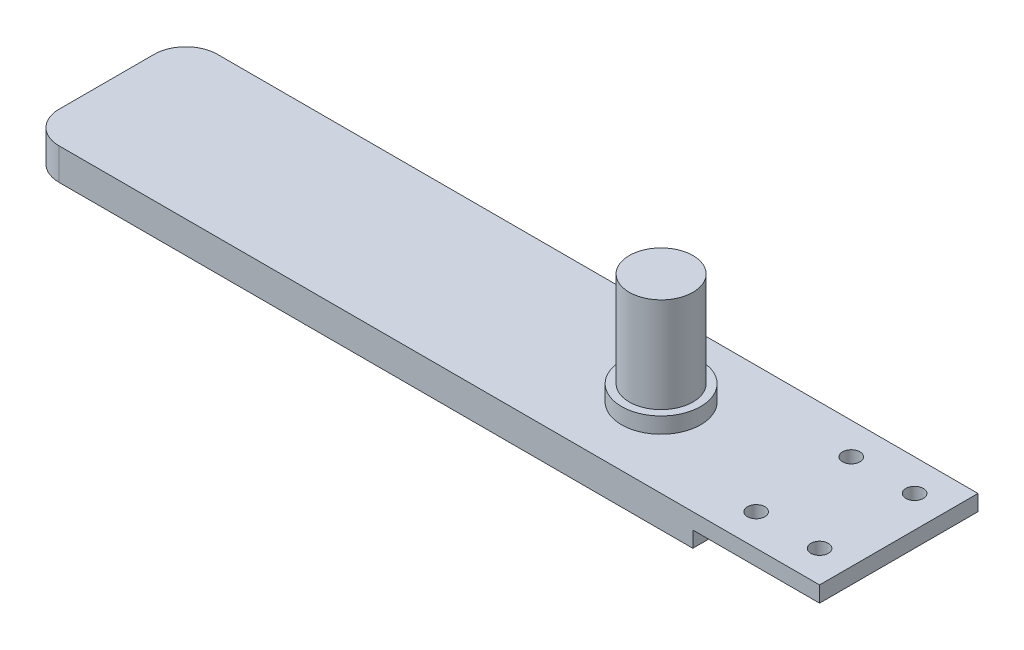
ISO-10303-21;
HEADER;
FILE_DESCRIPTION(('STEP AP214'),'2;1');
FILE_NAME('part.step','',(''),(''),'','','');
FILE_SCHEMA(('AUTOMOTIVE_DESIGN { 1 0 10303 214 1 1 1 1 }'));
ENDSEC;
DATA;
#1=APPLICATION_CONTEXT('core data for automotive mechanical design processes');
#2=APPLICATION_PROTOCOL_DEFINITION('international standard','automotive_design',2000,#1);
#3=PRODUCT_CONTEXT('',#1,'mechanical');
#4=PRODUCT('Part','Part','',(#3));
#5=PRODUCT_RELATED_PRODUCT_CATEGORY('part','',(#4));
#6=PRODUCT_DEFINITION_FORMATION('','',#4);
#7=PRODUCT_DEFINITION_CONTEXT('part definition',#1,'design');
#8=PRODUCT_DEFINITION('design','',#6,#7);
#9=PRODUCT_DEFINITION_SHAPE('','',#8);
#10=(LENGTH_UNIT() NAMED_UNIT(*) SI_UNIT(.MILLI.,.METRE.));
#11=(NAMED_UNIT(*) PLANE_ANGLE_UNIT() SI_UNIT($,.RADIAN.));
#12=(NAMED_UNIT(*) SI_UNIT($,.STERADIAN.) SOLID_ANGLE_UNIT());
#13=UNCERTAINTY_MEASURE_WITH_UNIT(LENGTH_MEASURE(1.E-05),#10,'distance_accuracy_value','');
#14=(GEOMETRIC_REPRESENTATION_CONTEXT(3) GLOBAL_UNCERTAINTY_ASSIGNED_CONTEXT((#13)) GLOBAL_UNIT_ASSIGNED_CONTEXT((#10,
#11,#12)) REPRESENTATION_CONTEXT('',''));
#15=CARTESIAN_POINT('',(0.,0.,0.));
#16=DIRECTION('',(0.,0.,1.));
#17=DIRECTION('',(1.,0.,0.));
#18=AXIS2_PLACEMENT_3D('',#15,#16,#17);
#19=CARTESIAN_POINT('',(50.,10.,-25.));
#20=DIRECTION('',(-1.,0.,0.));
#21=DIRECTION('',(0.,0.,1.));
#22=AXIS2_PLACEMENT_3D('',#19,#20,#21);
#23=PLANE('',#22);
#24=DIRECTION('',(0.,-1.,0.));
#25=VECTOR('',#24,1.);
#26=CARTESIAN_POINT('',(50.,10.,25.));
#27=LINE('',#26,#25);
#28=CARTESIAN_POINT('',(50.,10.,25.));
#29=VERTEX_POINT('',#28);
#30=CARTESIAN_POINT('',(50.,5.,25.));
#31=VERTEX_POINT('',#30);
#32=EDGE_CURVE('E122',#29,#31,#27,.T.);
#33=ORIENTED_EDGE('',*,*,#32,.T.);
#34=DIRECTION('',(0.,0.,1.));
#35=VECTOR('',#34,1.);
#36=CARTESIAN_POINT('',(50.,5.,25.));
#37=LINE('',#36,#35);
#38=CARTESIAN_POINT('',(50.,5.,-25.));
#39=VERTEX_POINT('',#38);
#40=EDGE_CURVE('E106',#39,#31,#37,.T.);
#41=ORIENTED_EDGE('',*,*,#40,.F.);
#42=DIRECTION('',(0.,-1.,0.));
#43=VECTOR('',#42,1.);
#44=CARTESIAN_POINT('',(50.,10.,-25.));
#45=LINE('',#44,#43);
#46=CARTESIAN_POINT('',(50.,10.,-25.));
#47=VERTEX_POINT('',#46);
#48=EDGE_CURVE('E130',#47,#39,#45,.T.);
#49=ORIENTED_EDGE('',*,*,#48,.F.);
#50=DIRECTION('',(0.,0.,-1.));
#51=VECTOR('',#50,1.);
#52=CARTESIAN_POINT('',(50.,10.,-25.));
#53=LINE('',#52,#51);
#54=EDGE_CURVE('E129',#29,#47,#53,.T.);
#55=ORIENTED_EDGE('',*,*,#54,.F.);
#56=EDGE_LOOP('',(#33,#41,#49,#55));
#57=FACE_BOUND('',#56,.T.);
#58=ADVANCED_FACE('F41',(#57),#23,.F.);
#59=CARTESIAN_POINT('',(-50.,10.,-25.));
#60=DIRECTION('',(0.,0.,1.));
#61=DIRECTION('',(1.,0.,0.));
#62=AXIS2_PLACEMENT_3D('',#59,#60,#61);
#63=PLANE('',#62);
#64=DIRECTION('',(-1.,0.,0.));
#65=VECTOR('',#64,1.);
#66=CARTESIAN_POINT('',(-50.,0.,-25.));
#67=LINE('',#66,#65);
#68=CARTESIAN_POINT('',(10.,0.,-25.));
#69=VERTEX_POINT('',#68);
#70=CARTESIAN_POINT('',(-190.,0.,-25.));
#71=VERTEX_POINT('',#70);
#72=EDGE_CURVE('E177',#69,#71,#67,.T.);
#73=ORIENTED_EDGE('',*,*,#72,.T.);
#74=DIRECTION('',(0.,1.,0.));
#75=VECTOR('',#74,1.);
#76=CARTESIAN_POINT('',(-190.,10.,-25.));
#77=LINE('',#76,#75);
#78=CARTESIAN_POINT('',(-190.,10.,-25.));
#79=VERTEX_POINT('',#78);
#80=EDGE_CURVE('E160',#71,#79,#77,.T.);
#81=ORIENTED_EDGE('',*,*,#80,.T.);
#82=DIRECTION('',(-1.,0.,0.));
#83=VECTOR('',#82,1.);
#84=CARTESIAN_POINT('',(-50.,10.,-25.));
#85=LINE('',#84,#83);
#86=EDGE_CURVE('E135',#47,#79,#85,.T.);
#87=ORIENTED_EDGE('',*,*,#86,.F.);
#88=ORIENTED_EDGE('',*,*,#48,.T.);
#89=DIRECTION('',(1.,0.,0.));
#90=VECTOR('',#89,1.);
#91=CARTESIAN_POINT('',(50.,5.,-25.));
#92=LINE('',#91,#90);
#93=CARTESIAN_POINT('',(10.,5.,-25.));
#94=VERTEX_POINT('',#93);
#95=EDGE_CURVE('E113',#94,#39,#92,.T.);
#96=ORIENTED_EDGE('',*,*,#95,.F.);
#97=DIRECTION('',(0.,-1.,0.));
#98=VECTOR('',#97,1.);
#99=CARTESIAN_POINT('',(10.,5.,-25.));
#100=LINE('',#99,#98);
#101=EDGE_CURVE('E186',#94,#69,#100,.T.);
#102=ORIENTED_EDGE('',*,*,#101,.T.);
#103=EDGE_LOOP('',(#73,#81,#87,#88,#96,#102));
#104=FACE_BOUND('',#103,.T.);
#105=ADVANCED_FACE('F184',(#104),#63,.F.);
#106=CARTESIAN_POINT('',(-50.,10.,25.));
#107=DIRECTION('',(0.,0.,-1.));
#108=DIRECTION('',(-1.,0.,0.));
#109=AXIS2_PLACEMENT_3D('',#106,#107,#108);
#110=PLANE('',#109);
#111=DIRECTION('',(1.,0.,0.));
#112=VECTOR('',#111,1.);
#113=CARTESIAN_POINT('',(-50.,10.,25.));
#114=LINE('',#113,#112);
#115=CARTESIAN_POINT('',(-190.,10.,25.));
#116=VERTEX_POINT('',#115);
#117=EDGE_CURVE('E131',#116,#29,#114,.T.);
#118=ORIENTED_EDGE('',*,*,#117,.F.);
#119=DIRECTION('',(0.,1.,0.));
#120=VECTOR('',#119,1.);
#121=CARTESIAN_POINT('',(-190.,0.,25.));
#122=LINE('',#121,#120);
#123=CARTESIAN_POINT('',(-190.,0.,25.));
#124=VERTEX_POINT('',#123);
#125=EDGE_CURVE('E11',#116,#124,#122,.F.);
#126=ORIENTED_EDGE('',*,*,#125,.T.);
#127=DIRECTION('',(1.,0.,0.));
#128=VECTOR('',#127,1.);
#129=CARTESIAN_POINT('',(-50.,0.,25.));
#130=LINE('',#129,#128);
#131=CARTESIAN_POINT('',(10.,0.,25.));
#132=VERTEX_POINT('',#131);
#133=EDGE_CURVE('E138',#124,#132,#130,.T.);
#134=ORIENTED_EDGE('',*,*,#133,.T.);
#135=DIRECTION('',(0.,-1.,0.));
#136=VECTOR('',#135,1.);
#137=CARTESIAN_POINT('',(10.,5.,25.));
#138=LINE('',#137,#136);
#139=CARTESIAN_POINT('',(10.,5.,25.));
#140=VERTEX_POINT('',#139);
#141=EDGE_CURVE('E125',#140,#132,#138,.T.);
#142=ORIENTED_EDGE('',*,*,#141,.F.);
#143=DIRECTION('',(-1.,0.,0.));
#144=VECTOR('',#143,1.);
#145=CARTESIAN_POINT('',(50.,5.,25.));
#146=LINE('',#145,#144);
#147=EDGE_CURVE('E110',#31,#140,#146,.T.);
#148=ORIENTED_EDGE('',*,*,#147,.F.);
#149=ORIENTED_EDGE('',*,*,#32,.F.);
#150=EDGE_LOOP('',(#118,#126,#134,#142,#148,#149));
#151=FACE_BOUND('',#150,.T.);
#152=ADVANCED_FACE('F121',(#151),#110,.F.);
#153=CARTESIAN_POINT('',(0.,10.,0.));
#154=DIRECTION('',(0.,1.,0.));
#155=DIRECTION('',(0.,0.,1.));
#156=AXIS2_PLACEMENT_3D('',#153,#154,#155);
#157=PLANE('',#156);
#158=CARTESIAN_POINT('',(40.,10.,-15.));
#159=DIRECTION('',(0.,1.,0.));
#160=DIRECTION('',(0.,0.,1.));
#161=AXIS2_PLACEMENT_3D('',#158,#159,#160);
#162=CIRCLE('',#161,2.74999999999999);
#163=CARTESIAN_POINT('',(40.,10.,-12.25));
#164=VERTEX_POINT('',#163);
#165=EDGE_CURVE('E155',#164,#164,#162,.T.);
#166=ORIENTED_EDGE('',*,*,#165,.F.);
#167=EDGE_LOOP('',(#166));
#168=FACE_BOUND('',#167,.T.);
#169=CARTESIAN_POINT('',(40.,10.,15.));
#170=DIRECTION('',(0.,1.,0.));
#171=DIRECTION('',(0.,0.,1.));
#172=AXIS2_PLACEMENT_3D('',#169,#170,#171);
#173=CIRCLE('',#172,2.74999999999999);
#174=CARTESIAN_POINT('',(40.,10.,17.75));
#175=VERTEX_POINT('',#174);
#176=EDGE_CURVE('E150',#175,#175,#173,.T.);
#177=ORIENTED_EDGE('',*,*,#176,.F.);
#178=EDGE_LOOP('',(#177));
#179=FACE_BOUND('',#178,.T.);
#180=CARTESIAN_POINT('',(20.,10.,15.));
#181=DIRECTION('',(0.,1.,0.));
#182=DIRECTION('',(0.,0.,1.));
#183=AXIS2_PLACEMENT_3D('',#180,#181,#182);
#184=CIRCLE('',#183,2.74999999999999);
#185=CARTESIAN_POINT('',(20.,10.,17.75));
#186=VERTEX_POINT('',#185);
#187=EDGE_CURVE('E145',#186,#186,#184,.T.);
#188=ORIENTED_EDGE('',*,*,#187,.F.);
#189=EDGE_LOOP('',(#188));
#190=FACE_BOUND('',#189,.T.);
#191=CARTESIAN_POINT('',(20.,10.,-15.));
#192=DIRECTION('',(0.,1.,0.));
#193=DIRECTION('',(0.,0.,1.));
#194=AXIS2_PLACEMENT_3D('',#191,#192,#193);
#195=CIRCLE('',#194,2.74999999999999);
#196=CARTESIAN_POINT('',(20.,10.,-12.25));
#197=VERTEX_POINT('',#196);
#198=EDGE_CURVE('E141',#197,#197,#195,.T.);
#199=ORIENTED_EDGE('',*,*,#198,.F.);
#200=EDGE_LOOP('',(#199));
#201=FACE_BOUND('',#200,.T.);
#202=CARTESIAN_POINT('',(-25.,10.,0.));
#203=DIRECTION('',(0.,1.,0.));
#204=DIRECTION('',(0.,0.,1.));
#205=AXIS2_PLACEMENT_3D('',#202,#203,#204);
#206=CIRCLE('',#205,12.5);
#207=CARTESIAN_POINT('',(-25.,10.,12.5));
#208=VERTEX_POINT('',#207);
#209=EDGE_CURVE('E200',#208,#208,#206,.T.);
#210=ORIENTED_EDGE('',*,*,#209,.F.);
#211=EDGE_LOOP('',(#210));
#212=FACE_BOUND('',#211,.T.);
#213=ORIENTED_EDGE('',*,*,#86,.T.);
#214=CARTESIAN_POINT('',(-190.,10.,-15.));
#215=DIRECTION('',(0.,1.,0.));
#216=DIRECTION('',(0.,0.,1.));
#217=AXIS2_PLACEMENT_3D('',#214,#215,#216);
#218=CIRCLE('',#217,10.);
#219=CARTESIAN_POINT('',(-200.,10.,-15.));
#220=VERTEX_POINT('',#219);
#221=EDGE_CURVE('E165',#79,#220,#218,.T.);
#222=ORIENTED_EDGE('',*,*,#221,.T.);
#223=DIRECTION('',(0.,0.,1.));
#224=VECTOR('',#223,1.);
#225=CARTESIAN_POINT('',(-200.,10.,0.));
#226=LINE('',#225,#224);
#227=CARTESIAN_POINT('',(-200.,10.,15.));
#228=VERTEX_POINT('',#227);
#229=EDGE_CURVE('E192',#220,#228,#226,.T.);
#230=ORIENTED_EDGE('',*,*,#229,.T.);
#231=CARTESIAN_POINT('',(-190.,10.,15.));
#232=DIRECTION('',(0.,1.,0.));
#233=DIRECTION('',(0.,0.,1.));
#234=AXIS2_PLACEMENT_3D('',#231,#232,#233);
#235=CIRCLE('',#234,10.);
#236=EDGE_CURVE('E163',#228,#116,#235,.T.);
#237=ORIENTED_EDGE('',*,*,#236,.T.);
#238=ORIENTED_EDGE('',*,*,#117,.T.);
#239=ORIENTED_EDGE('',*,*,#54,.T.);
#240=EDGE_LOOP('',(#213,#222,#230,#237,#238,#239));
#241=FACE_BOUND('',#240,.T.);
#242=ADVANCED_FACE('F191',(#168,#179,#190,#201,#212,#241),#157,.T.);
#243=CARTESIAN_POINT('',(0.,0.,0.));
#244=DIRECTION('',(0.,1.,0.));
#245=DIRECTION('',(0.,0.,1.));
#246=AXIS2_PLACEMENT_3D('',#243,#244,#245);
#247=PLANE('',#246);
#248=DIRECTION('',(0.,0.,1.));
#249=VECTOR('',#248,1.);
#250=CARTESIAN_POINT('',(-200.,0.,0.));
#251=LINE('',#250,#249);
#252=CARTESIAN_POINT('',(-200.,0.,-15.));
#253=VERTEX_POINT('',#252);
#254=CARTESIAN_POINT('',(-200.,0.,15.));
#255=VERTEX_POINT('',#254);
#256=EDGE_CURVE('E178',#253,#255,#251,.T.);
#257=ORIENTED_EDGE('',*,*,#256,.F.);
#258=CARTESIAN_POINT('',(-190.,0.,-15.));
#259=DIRECTION('',(0.,1.,0.));
#260=DIRECTION('',(0.,0.,1.));
#261=AXIS2_PLACEMENT_3D('',#258,#259,#260);
#262=CIRCLE('',#261,10.);
#263=EDGE_CURVE('E49',#253,#71,#262,.F.);
#264=ORIENTED_EDGE('',*,*,#263,.T.);
#265=ORIENTED_EDGE('',*,*,#72,.F.);
#266=DIRECTION('',(0.,0.,-1.));
#267=VECTOR('',#266,1.);
#268=CARTESIAN_POINT('',(10.,0.,25.));
#269=LINE('',#268,#267);
#270=EDGE_CURVE('E118',#132,#69,#269,.T.);
#271=ORIENTED_EDGE('',*,*,#270,.F.);
#272=ORIENTED_EDGE('',*,*,#133,.F.);
#273=CARTESIAN_POINT('',(-190.,0.,15.));
#274=DIRECTION('',(0.,1.,0.));
#275=DIRECTION('',(0.,0.,1.));
#276=AXIS2_PLACEMENT_3D('',#273,#274,#275);
#277=CIRCLE('',#276,10.);
#278=EDGE_CURVE('E61',#124,#255,#277,.F.);
#279=ORIENTED_EDGE('',*,*,#278,.T.);
#280=EDGE_LOOP('',(#257,#264,#265,#271,#272,#279));
#281=FACE_BOUND('',#280,.T.);
#282=ADVANCED_FACE('F175',(#281),#247,.F.);
#283=CARTESIAN_POINT('',(-200.,0.,0.));
#284=DIRECTION('',(-1.,0.,0.));
#285=DIRECTION('',(0.,0.,1.));
#286=AXIS2_PLACEMENT_3D('',#283,#284,#285);
#287=PLANE('',#286);
#288=ORIENTED_EDGE('',*,*,#229,.F.);
#289=DIRECTION('',(0.,1.,0.));
#290=VECTOR('',#289,1.);
#291=CARTESIAN_POINT('',(-200.,0.,-15.));
#292=LINE('',#291,#290);
#293=EDGE_CURVE('E170',#220,#253,#292,.F.);
#294=ORIENTED_EDGE('',*,*,#293,.T.);
#295=ORIENTED_EDGE('',*,*,#256,.T.);
#296=DIRECTION('',(0.,1.,0.));
#297=VECTOR('',#296,1.);
#298=CARTESIAN_POINT('',(-200.,10.,15.));
#299=LINE('',#298,#297);
#300=EDGE_CURVE('E167',#255,#228,#299,.T.);
#301=ORIENTED_EDGE('',*,*,#300,.T.);
#302=EDGE_LOOP('',(#288,#294,#295,#301));
#303=FACE_BOUND('',#302,.T.);
#304=ADVANCED_FACE('F194',(#303),#287,.T.);
#305=CARTESIAN_POINT('',(-25.,15.,0.));
#306=DIRECTION('',(0.,-1.,0.));
#307=DIRECTION('',(0.,0.,-1.));
#308=AXIS2_PLACEMENT_3D('',#305,#306,#307);
#309=CYLINDRICAL_SURFACE('',#308,12.5);
#310=CARTESIAN_POINT('',(-25.,15.,0.));
#311=DIRECTION('',(0.,1.,0.));
#312=DIRECTION('',(0.,0.,1.));
#313=AXIS2_PLACEMENT_3D('',#310,#311,#312);
#314=CIRCLE('',#313,12.5);
#315=CARTESIAN_POINT('',(-25.,15.,12.5));
#316=VERTEX_POINT('',#315);
#317=EDGE_CURVE('E196',#316,#316,#314,.T.);
#318=ORIENTED_EDGE('',*,*,#317,.F.);
#319=EDGE_LOOP('',(#318));
#320=FACE_BOUND('',#319,.T.);
#321=ORIENTED_EDGE('',*,*,#209,.T.);
#322=EDGE_LOOP('',(#321));
#323=FACE_BOUND('',#322,.T.);
#324=ADVANCED_FACE('F220',(#320,#323),#309,.T.);
#325=CARTESIAN_POINT('',(-25.,15.,0.));
#326=DIRECTION('',(0.,1.,0.));
#327=DIRECTION('',(0.,0.,1.));
#328=AXIS2_PLACEMENT_3D('',#325,#326,#327);
#329=PLANE('',#328);
#330=CARTESIAN_POINT('',(-25.,15.,0.));
#331=DIRECTION('',(0.,1.,0.));
#332=DIRECTION('',(0.,0.,1.));
#333=AXIS2_PLACEMENT_3D('',#330,#331,#332);
#334=CIRCLE('',#333,10.05);
#335=CARTESIAN_POINT('',(-25.,15.,10.05));
#336=VERTEX_POINT('',#335);
#337=EDGE_CURVE('E133',#336,#336,#334,.T.);
#338=ORIENTED_EDGE('',*,*,#337,.F.);
#339=EDGE_LOOP('',(#338));
#340=FACE_BOUND('',#339,.T.);
#341=ORIENTED_EDGE('',*,*,#317,.T.);
#342=EDGE_LOOP('',(#341));
#343=FACE_BOUND('',#342,.T.);
#344=ADVANCED_FACE('F295',(#340,#343),#329,.T.);
#345=CARTESIAN_POINT('',(-25.,45.,0.));
#346=DIRECTION('',(0.,-1.,0.));
#347=DIRECTION('',(0.,0.,-1.));
#348=AXIS2_PLACEMENT_3D('',#345,#346,#347);
#349=CYLINDRICAL_SURFACE('',#348,10.05);
#350=CARTESIAN_POINT('',(-25.,45.,0.));
#351=DIRECTION('',(0.,1.,0.));
#352=DIRECTION('',(0.,0.,1.));
#353=AXIS2_PLACEMENT_3D('',#350,#351,#352);
#354=CIRCLE('',#353,10.05);
#355=CARTESIAN_POINT('',(-25.,45.,10.05));
#356=VERTEX_POINT('',#355);
#357=EDGE_CURVE('E212',#356,#356,#354,.T.);
#358=ORIENTED_EDGE('',*,*,#357,.F.);
#359=EDGE_LOOP('',(#358));
#360=FACE_BOUND('',#359,.T.);
#361=ORIENTED_EDGE('',*,*,#337,.T.);
#362=EDGE_LOOP('',(#361));
#363=FACE_BOUND('',#362,.T.);
#364=ADVANCED_FACE('F291',(#360,#363),#349,.T.);
#365=CARTESIAN_POINT('',(-25.,45.,0.));
#366=DIRECTION('',(0.,1.,0.));
#367=DIRECTION('',(0.,0.,1.));
#368=AXIS2_PLACEMENT_3D('',#365,#366,#367);
#369=PLANE('',#368);
#370=ORIENTED_EDGE('',*,*,#357,.T.);
#371=EDGE_LOOP('',(#370));
#372=FACE_BOUND('',#371,.T.);
#373=ADVANCED_FACE('F289',(#372),#369,.T.);
#374=CARTESIAN_POINT('',(10.,5.,25.));
#375=DIRECTION('',(-1.,0.,0.));
#376=DIRECTION('',(0.,0.,1.));
#377=AXIS2_PLACEMENT_3D('',#374,#375,#376);
#378=PLANE('',#377);
#379=ORIENTED_EDGE('',*,*,#270,.T.);
#380=ORIENTED_EDGE('',*,*,#101,.F.);
#381=DIRECTION('',(0.,0.,-1.));
#382=VECTOR('',#381,1.);
#383=CARTESIAN_POINT('',(10.,5.,25.));
#384=LINE('',#383,#382);
#385=EDGE_CURVE('E126',#140,#94,#384,.T.);
#386=ORIENTED_EDGE('',*,*,#385,.F.);
#387=ORIENTED_EDGE('',*,*,#141,.T.);
#388=EDGE_LOOP('',(#379,#380,#386,#387));
#389=FACE_BOUND('',#388,.T.);
#390=ADVANCED_FACE('F206',(#389),#378,.F.);
#391=CARTESIAN_POINT('',(0.,5.,0.));
#392=DIRECTION('',(0.,1.,0.));
#393=DIRECTION('',(0.,0.,1.));
#394=AXIS2_PLACEMENT_3D('',#391,#392,#393);
#395=PLANE('',#394);
#396=CARTESIAN_POINT('',(40.,5.,-15.));
#397=DIRECTION('',(0.,-1.,0.));
#398=DIRECTION('',(0.,0.,-1.));
#399=AXIS2_PLACEMENT_3D('',#396,#397,#398);
#400=CIRCLE('',#399,2.775);
#401=CARTESIAN_POINT('',(40.,5.,-17.775));
#402=VERTEX_POINT('',#401);
#403=EDGE_CURVE('E458',#402,#402,#400,.T.);
#404=ORIENTED_EDGE('',*,*,#403,.F.);
#405=EDGE_LOOP('',(#404));
#406=FACE_BOUND('',#405,.T.);
#407=CARTESIAN_POINT('',(40.,5.,15.));
#408=DIRECTION('',(0.,-1.,0.));
#409=DIRECTION('',(0.,0.,-1.));
#410=AXIS2_PLACEMENT_3D('',#407,#408,#409);
#411=CIRCLE('',#410,2.775);
#412=CARTESIAN_POINT('',(40.,5.,12.225));
#413=VERTEX_POINT('',#412);
#414=EDGE_CURVE('E158',#413,#413,#411,.T.);
#415=ORIENTED_EDGE('',*,*,#414,.F.);
#416=EDGE_LOOP('',(#415));
#417=FACE_BOUND('',#416,.T.);
#418=CARTESIAN_POINT('',(20.,5.,15.));
#419=DIRECTION('',(0.,-1.,0.));
#420=DIRECTION('',(0.,0.,-1.));
#421=AXIS2_PLACEMENT_3D('',#418,#419,#420);
#422=CIRCLE('',#421,2.775);
#423=CARTESIAN_POINT('',(20.,5.,12.225));
#424=VERTEX_POINT('',#423);
#425=EDGE_CURVE('E153',#424,#424,#422,.T.);
#426=ORIENTED_EDGE('',*,*,#425,.F.);
#427=EDGE_LOOP('',(#426));
#428=FACE_BOUND('',#427,.T.);
#429=CARTESIAN_POINT('',(20.,5.,-15.));
#430=DIRECTION('',(0.,-1.,0.));
#431=DIRECTION('',(0.,0.,-1.));
#432=AXIS2_PLACEMENT_3D('',#429,#430,#431);
#433=CIRCLE('',#432,2.775);
#434=CARTESIAN_POINT('',(20.,5.,-17.775));
#435=VERTEX_POINT('',#434);
#436=EDGE_CURVE('E148',#435,#435,#433,.T.);
#437=ORIENTED_EDGE('',*,*,#436,.F.);
#438=EDGE_LOOP('',(#437));
#439=FACE_BOUND('',#438,.T.);
#440=ORIENTED_EDGE('',*,*,#40,.T.);
#441=ORIENTED_EDGE('',*,*,#147,.T.);
#442=ORIENTED_EDGE('',*,*,#385,.T.);
#443=ORIENTED_EDGE('',*,*,#95,.T.);
#444=EDGE_LOOP('',(#440,#441,#442,#443));
#445=FACE_BOUND('',#444,.T.);
#446=ADVANCED_FACE('F108',(#406,#417,#428,#439,#445),#395,.F.);
#447=CARTESIAN_POINT('',(20.,5.,-15.));
#448=DIRECTION('',(0.,-1.,0.));
#449=DIRECTION('',(0.,0.,-1.));
#450=AXIS2_PLACEMENT_3D('',#447,#448,#449);
#451=CYLINDRICAL_SURFACE('',#450,2.74999999999999);
#452=ORIENTED_EDGE('',*,*,#198,.T.);
#453=EDGE_LOOP('',(#452));
#454=FACE_BOUND('',#453,.T.);
#455=CARTESIAN_POINT('',(20.,5.025,-15.));
#456=DIRECTION('',(0.,-1.,0.));
#457=DIRECTION('',(0.,0.,-1.));
#458=AXIS2_PLACEMENT_3D('',#455,#456,#457);
#459=CIRCLE('',#458,2.74999999999999);
#460=CARTESIAN_POINT('',(20.,5.025,-17.75));
#461=VERTEX_POINT('',#460);
#462=EDGE_CURVE('E144',#461,#461,#459,.T.);
#463=ORIENTED_EDGE('',*,*,#462,.T.);
#464=EDGE_LOOP('',(#463));
#465=FACE_BOUND('',#464,.T.);
#466=ADVANCED_FACE('F280',(#454,#465),#451,.F.);
#467=CARTESIAN_POINT('',(20.,5.,-15.));
#468=DIRECTION('',(0.,-1.,0.));
#469=DIRECTION('',(0.,0.,-1.));
#470=AXIS2_PLACEMENT_3D('',#467,#468,#469);
#471=CONICAL_SURFACE('',#470,2.775,0.785398163397691);
#472=ORIENTED_EDGE('',*,*,#462,.F.);
#473=EDGE_LOOP('',(#472));
#474=FACE_BOUND('',#473,.T.);
#475=ORIENTED_EDGE('',*,*,#436,.T.);
#476=EDGE_LOOP('',(#475));
#477=FACE_BOUND('',#476,.T.);
#478=ADVANCED_FACE('F276',(#474,#477),#471,.F.);
#479=CARTESIAN_POINT('',(20.,5.,15.));
#480=DIRECTION('',(0.,-1.,0.));
#481=DIRECTION('',(0.,0.,-1.));
#482=AXIS2_PLACEMENT_3D('',#479,#480,#481);
#483=CYLINDRICAL_SURFACE('',#482,2.74999999999999);
#484=ORIENTED_EDGE('',*,*,#187,.T.);
#485=EDGE_LOOP('',(#484));
#486=FACE_BOUND('',#485,.T.);
#487=CARTESIAN_POINT('',(20.,5.025,15.));
#488=DIRECTION('',(0.,-1.,0.));
#489=DIRECTION('',(0.,0.,-1.));
#490=AXIS2_PLACEMENT_3D('',#487,#488,#489);
#491=CIRCLE('',#490,2.74999999999999);
#492=CARTESIAN_POINT('',(20.,5.025,12.25));
#493=VERTEX_POINT('',#492);
#494=EDGE_CURVE('E149',#493,#493,#491,.T.);
#495=ORIENTED_EDGE('',*,*,#494,.T.);
#496=EDGE_LOOP('',(#495));
#497=FACE_BOUND('',#496,.T.);
#498=ADVANCED_FACE('F272',(#486,#497),#483,.F.);
#499=CARTESIAN_POINT('',(20.,5.,15.));
#500=DIRECTION('',(0.,-1.,0.));
#501=DIRECTION('',(0.,0.,-1.));
#502=AXIS2_PLACEMENT_3D('',#499,#500,#501);
#503=CONICAL_SURFACE('',#502,2.775,0.785398163397691);
#504=ORIENTED_EDGE('',*,*,#494,.F.);
#505=EDGE_LOOP('',(#504));
#506=FACE_BOUND('',#505,.T.);
#507=ORIENTED_EDGE('',*,*,#425,.T.);
#508=EDGE_LOOP('',(#507));
#509=FACE_BOUND('',#508,.T.);
#510=ADVANCED_FACE('F268',(#506,#509),#503,.F.);
#511=CARTESIAN_POINT('',(40.,5.,15.));
#512=DIRECTION('',(0.,-1.,0.));
#513=DIRECTION('',(0.,0.,-1.));
#514=AXIS2_PLACEMENT_3D('',#511,#512,#513);
#515=CYLINDRICAL_SURFACE('',#514,2.74999999999999);
#516=ORIENTED_EDGE('',*,*,#176,.T.);
#517=EDGE_LOOP('',(#516));
#518=FACE_BOUND('',#517,.T.);
#519=CARTESIAN_POINT('',(40.,5.025,15.));
#520=DIRECTION('',(0.,-1.,0.));
#521=DIRECTION('',(0.,0.,-1.));
#522=AXIS2_PLACEMENT_3D('',#519,#520,#521);
#523=CIRCLE('',#522,2.74999999999999);
#524=CARTESIAN_POINT('',(40.,5.025,12.25));
#525=VERTEX_POINT('',#524);
#526=EDGE_CURVE('E154',#525,#525,#523,.T.);
#527=ORIENTED_EDGE('',*,*,#526,.T.);
#528=EDGE_LOOP('',(#527));
#529=FACE_BOUND('',#528,.T.);
#530=ADVANCED_FACE('F264',(#518,#529),#515,.F.);
#531=CARTESIAN_POINT('',(40.,5.,15.));
#532=DIRECTION('',(0.,-1.,0.));
#533=DIRECTION('',(0.,0.,-1.));
#534=AXIS2_PLACEMENT_3D('',#531,#532,#533);
#535=CONICAL_SURFACE('',#534,2.775,0.785398163397691);
#536=ORIENTED_EDGE('',*,*,#526,.F.);
#537=EDGE_LOOP('',(#536));
#538=FACE_BOUND('',#537,.T.);
#539=ORIENTED_EDGE('',*,*,#414,.T.);
#540=EDGE_LOOP('',(#539));
#541=FACE_BOUND('',#540,.T.);
#542=ADVANCED_FACE('F256',(#538,#541),#535,.F.);
#543=CARTESIAN_POINT('',(40.,5.,-15.));
#544=DIRECTION('',(0.,-1.,0.));
#545=DIRECTION('',(0.,0.,-1.));
#546=AXIS2_PLACEMENT_3D('',#543,#544,#545);
#547=CYLINDRICAL_SURFACE('',#546,2.74999999999999);
#548=ORIENTED_EDGE('',*,*,#165,.T.);
#549=EDGE_LOOP('',(#548));
#550=FACE_BOUND('',#549,.T.);
#551=CARTESIAN_POINT('',(40.,5.025,-15.));
#552=DIRECTION('',(0.,-1.,0.));
#553=DIRECTION('',(0.,0.,-1.));
#554=AXIS2_PLACEMENT_3D('',#551,#552,#553);
#555=CIRCLE('',#554,2.74999999999999);
#556=CARTESIAN_POINT('',(40.,5.025,-17.75));
#557=VERTEX_POINT('',#556);
#558=EDGE_CURVE('E159',#557,#557,#555,.T.);
#559=ORIENTED_EDGE('',*,*,#558,.T.);
#560=EDGE_LOOP('',(#559));
#561=FACE_BOUND('',#560,.T.);
#562=ADVANCED_FACE('F250',(#550,#561),#547,.F.);
#563=CARTESIAN_POINT('',(40.,5.,-15.));
#564=DIRECTION('',(0.,-1.,0.));
#565=DIRECTION('',(0.,0.,-1.));
#566=AXIS2_PLACEMENT_3D('',#563,#564,#565);
#567=CONICAL_SURFACE('',#566,2.775,0.785398163397691);
#568=ORIENTED_EDGE('',*,*,#558,.F.);
#569=EDGE_LOOP('',(#568));
#570=FACE_BOUND('',#569,.T.);
#571=ORIENTED_EDGE('',*,*,#403,.T.);
#572=EDGE_LOOP('',(#571));
#573=FACE_BOUND('',#572,.T.);
#574=ADVANCED_FACE('F243',(#570,#573),#567,.F.);
#575=CARTESIAN_POINT('',(-190.,10.,-15.));
#576=DIRECTION('',(0.,-1.,0.));
#577=DIRECTION('',(0.,0.,-1.));
#578=AXIS2_PLACEMENT_3D('',#575,#576,#577);
#579=CYLINDRICAL_SURFACE('',#578,10.);
#580=ORIENTED_EDGE('',*,*,#263,.F.);
#581=ORIENTED_EDGE('',*,*,#293,.F.);
#582=ORIENTED_EDGE('',*,*,#221,.F.);
#583=ORIENTED_EDGE('',*,*,#80,.F.);
#584=EDGE_LOOP('',(#580,#581,#582,#583));
#585=FACE_BOUND('',#584,.T.);
#586=ADVANCED_FACE('F187',(#585),#579,.T.);
#587=CARTESIAN_POINT('',(-190.,0.,15.));
#588=DIRECTION('',(0.,-1.,0.));
#589=DIRECTION('',(0.,0.,-1.));
#590=AXIS2_PLACEMENT_3D('',#587,#588,#589);
#591=CYLINDRICAL_SURFACE('',#590,10.);
#592=ORIENTED_EDGE('',*,*,#278,.F.);
#593=ORIENTED_EDGE('',*,*,#125,.F.);
#594=ORIENTED_EDGE('',*,*,#236,.F.);
#595=ORIENTED_EDGE('',*,*,#300,.F.);
#596=EDGE_LOOP('',(#592,#593,#594,#595));
#597=FACE_BOUND('',#596,.T.);
#598=ADVANCED_FACE('F43',(#597),#591,.T.);
#599=CLOSED_SHELL('',(#58,#105,#152,#242,#282,#304,#324,#344,#364,#373,#390,#446,#466,#478,#498,
#510,#530,#542,#562,#574,#586,#598));
#600=MANIFOLD_SOLID_BREP('B2',#599);
#601=ADVANCED_BREP_SHAPE_REPRESENTATION('',(#18,#600),#14);
#602=SHAPE_DEFINITION_REPRESENTATION(#9,#601);
ENDSEC;
END-ISO-10303-21;
